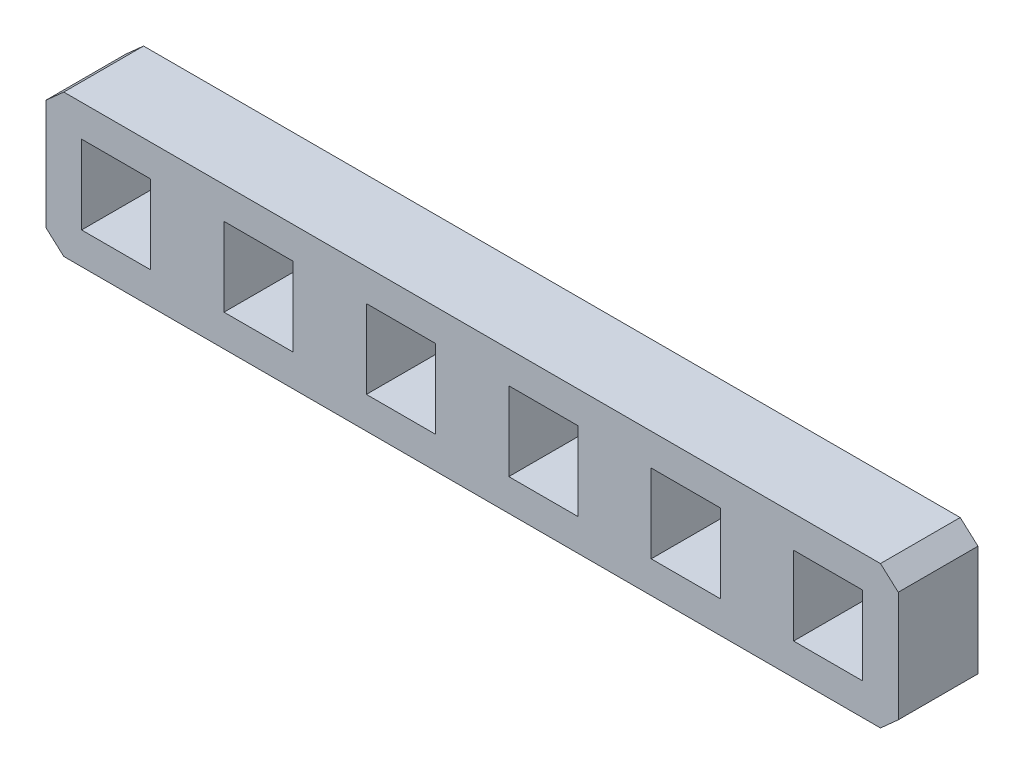
ISO-10303-21;
HEADER;
FILE_DESCRIPTION(('STEP AP214'),'2;1');
FILE_NAME('part.step','',(''),(''),'','','');
FILE_SCHEMA(('AUTOMOTIVE_DESIGN { 1 0 10303 214 1 1 1 1 }'));
ENDSEC;
DATA;
#1=APPLICATION_CONTEXT('core data for automotive mechanical design processes');
#2=APPLICATION_PROTOCOL_DEFINITION('international standard','automotive_design',2000,#1);
#3=PRODUCT_CONTEXT('',#1,'mechanical');
#4=PRODUCT('Part','Part','',(#3));
#5=PRODUCT_RELATED_PRODUCT_CATEGORY('part','',(#4));
#6=PRODUCT_DEFINITION_FORMATION('','',#4);
#7=PRODUCT_DEFINITION_CONTEXT('part definition',#1,'design');
#8=PRODUCT_DEFINITION('design','',#6,#7);
#9=PRODUCT_DEFINITION_SHAPE('','',#8);
#10=(LENGTH_UNIT() NAMED_UNIT(*) SI_UNIT(.MILLI.,.METRE.));
#11=(NAMED_UNIT(*) PLANE_ANGLE_UNIT() SI_UNIT($,.RADIAN.));
#12=(NAMED_UNIT(*) SI_UNIT($,.STERADIAN.) SOLID_ANGLE_UNIT());
#13=UNCERTAINTY_MEASURE_WITH_UNIT(LENGTH_MEASURE(1.E-05),#10,'distance_accuracy_value','');
#14=(GEOMETRIC_REPRESENTATION_CONTEXT(3) GLOBAL_UNCERTAINTY_ASSIGNED_CONTEXT((#13)) GLOBAL_UNIT_ASSIGNED_CONTEXT((#10,
#11,#12)) REPRESENTATION_CONTEXT('',''));
#15=CARTESIAN_POINT('',(0.,0.,0.));
#16=DIRECTION('',(0.,0.,1.));
#17=DIRECTION('',(1.,0.,0.));
#18=AXIS2_PLACEMENT_3D('',#15,#16,#17);
#19=CARTESIAN_POINT('',(0.,0.,5.6));
#20=DIRECTION('',(0.,0.,-1.));
#21=DIRECTION('',(-1.,0.,0.));
#22=AXIS2_PLACEMENT_3D('',#19,#20,#21);
#23=PLANE('',#22);
#24=DIRECTION('',(1.,0.,0.));
#25=VECTOR('',#24,1.);
#26=CARTESIAN_POINT('',(-18.05,-2.7625,5.6));
#27=LINE('',#26,#25);
#28=CARTESIAN_POINT('',(-18.05,-2.7625,5.6));
#29=VERTEX_POINT('',#28);
#30=CARTESIAN_POINT('',(-13.2,-2.7625,5.6));
#31=VERTEX_POINT('',#30);
#32=EDGE_CURVE('E278',#29,#31,#27,.T.);
#33=ORIENTED_EDGE('',*,*,#32,.F.);
#34=DIRECTION('',(0.,-1.,0.));
#35=VECTOR('',#34,1.);
#36=CARTESIAN_POINT('',(-18.05,-2.7625,5.6));
#37=LINE('',#36,#35);
#38=CARTESIAN_POINT('',(-18.05,2.7625,5.6));
#39=VERTEX_POINT('',#38);
#40=EDGE_CURVE('E286',#39,#29,#37,.T.);
#41=ORIENTED_EDGE('',*,*,#40,.F.);
#42=DIRECTION('',(-1.,0.,0.));
#43=VECTOR('',#42,1.);
#44=CARTESIAN_POINT('',(-18.05,2.7625,5.6));
#45=LINE('',#44,#43);
#46=CARTESIAN_POINT('',(-13.2,2.76250000000001,5.6));
#47=VERTEX_POINT('',#46);
#48=EDGE_CURVE('E283',#47,#39,#45,.T.);
#49=ORIENTED_EDGE('',*,*,#48,.F.);
#50=DIRECTION('',(0.,1.,0.));
#51=VECTOR('',#50,1.);
#52=CARTESIAN_POINT('',(-13.2,-2.7625,5.6));
#53=LINE('',#52,#51);
#54=EDGE_CURVE('E280',#31,#47,#53,.T.);
#55=ORIENTED_EDGE('',*,*,#54,.F.);
#56=EDGE_LOOP('',(#33,#41,#49,#55));
#57=FACE_BOUND('',#56,.T.);
#58=DIRECTION('',(0.,-1.,0.));
#59=VECTOR('',#58,1.);
#60=CARTESIAN_POINT('',(-28.05,-2.7625,5.6));
#61=LINE('',#60,#59);
#62=CARTESIAN_POINT('',(-28.05,2.7625,5.6));
#63=VERTEX_POINT('',#62);
#64=CARTESIAN_POINT('',(-28.05,-2.7625,5.6));
#65=VERTEX_POINT('',#64);
#66=EDGE_CURVE('E340',#63,#65,#61,.T.);
#67=ORIENTED_EDGE('',*,*,#66,.F.);
#68=DIRECTION('',(-1.,0.,0.));
#69=VECTOR('',#68,1.);
#70=CARTESIAN_POINT('',(-28.05,2.7625,5.6));
#71=LINE('',#70,#69);
#72=CARTESIAN_POINT('',(-23.1999999999999,2.76250000000001,5.6));
#73=VERTEX_POINT('',#72);
#74=EDGE_CURVE('E348',#73,#63,#71,.T.);
#75=ORIENTED_EDGE('',*,*,#74,.F.);
#76=DIRECTION('',(0.,1.,0.));
#77=VECTOR('',#76,1.);
#78=CARTESIAN_POINT('',(-23.1999999999999,-2.7625,5.6));
#79=LINE('',#78,#77);
#80=CARTESIAN_POINT('',(-23.1999999999999,-2.7625,5.6));
#81=VERTEX_POINT('',#80);
#82=EDGE_CURVE('E345',#81,#73,#79,.T.);
#83=ORIENTED_EDGE('',*,*,#82,.F.);
#84=DIRECTION('',(1.,0.,0.));
#85=VECTOR('',#84,1.);
#86=CARTESIAN_POINT('',(-28.05,-2.7625,5.6));
#87=LINE('',#86,#85);
#88=EDGE_CURVE('E342',#65,#81,#87,.T.);
#89=ORIENTED_EDGE('',*,*,#88,.F.);
#90=EDGE_LOOP('',(#67,#75,#83,#89));
#91=FACE_BOUND('',#90,.T.);
#92=DIRECTION('',(-1.,0.,0.));
#93=VECTOR('',#92,1.);
#94=CARTESIAN_POINT('',(21.95,2.7625,5.6));
#95=LINE('',#94,#93);
#96=CARTESIAN_POINT('',(26.8,2.76250000000001,5.6));
#97=VERTEX_POINT('',#96);
#98=CARTESIAN_POINT('',(21.95,2.7625,5.6));
#99=VERTEX_POINT('',#98);
#100=EDGE_CURVE('E402',#97,#99,#95,.T.);
#101=ORIENTED_EDGE('',*,*,#100,.F.);
#102=DIRECTION('',(0.,1.,0.));
#103=VECTOR('',#102,1.);
#104=CARTESIAN_POINT('',(26.8,-2.7625,5.6));
#105=LINE('',#104,#103);
#106=CARTESIAN_POINT('',(26.8,-2.7625,5.6));
#107=VERTEX_POINT('',#106);
#108=EDGE_CURVE('E410',#107,#97,#105,.T.);
#109=ORIENTED_EDGE('',*,*,#108,.F.);
#110=DIRECTION('',(1.,0.,0.));
#111=VECTOR('',#110,1.);
#112=CARTESIAN_POINT('',(21.95,-2.7625,5.6));
#113=LINE('',#112,#111);
#114=CARTESIAN_POINT('',(21.95,-2.7625,5.6));
#115=VERTEX_POINT('',#114);
#116=EDGE_CURVE('E407',#115,#107,#113,.T.);
#117=ORIENTED_EDGE('',*,*,#116,.F.);
#118=DIRECTION('',(0.,-1.,0.));
#119=VECTOR('',#118,1.);
#120=CARTESIAN_POINT('',(21.95,-2.7625,5.6));
#121=LINE('',#120,#119);
#122=EDGE_CURVE('E404',#99,#115,#121,.T.);
#123=ORIENTED_EDGE('',*,*,#122,.F.);
#124=EDGE_LOOP('',(#101,#109,#117,#123));
#125=FACE_BOUND('',#124,.T.);
#126=DIRECTION('',(-1.,0.,0.));
#127=VECTOR('',#126,1.);
#128=CARTESIAN_POINT('',(-29.3,4.99999999999998,5.6));
#129=LINE('',#128,#127);
#130=CARTESIAN_POINT('',(28.05,4.99999999999998,5.6));
#131=VERTEX_POINT('',#130);
#132=CARTESIAN_POINT('',(-29.3,4.99999999999998,5.6));
#133=VERTEX_POINT('',#132);
#134=EDGE_CURVE('E433',#131,#133,#129,.T.);
#135=ORIENTED_EDGE('',*,*,#134,.T.);
#136=DIRECTION('',(-0.745143863677784,-0.666903757991619,0.));
#137=VECTOR('',#136,1.);
#138=CARTESIAN_POINT('',(-29.3,4.99999999999998,5.6));
#139=LINE('',#138,#137);
#140=CARTESIAN_POINT('',(-30.55,3.88125,5.6));
#141=VERTEX_POINT('',#140);
#142=EDGE_CURVE('E436',#133,#141,#139,.T.);
#143=ORIENTED_EDGE('',*,*,#142,.T.);
#144=DIRECTION('',(0.,-1.,0.));
#145=VECTOR('',#144,1.);
#146=CARTESIAN_POINT('',(-30.55,3.88125,5.6));
#147=LINE('',#146,#145);
#148=CARTESIAN_POINT('',(-30.55,-3.88125000000001,5.6));
#149=VERTEX_POINT('',#148);
#150=EDGE_CURVE('E439',#141,#149,#147,.T.);
#151=ORIENTED_EDGE('',*,*,#150,.T.);
#152=DIRECTION('',(0.745143863677783,-0.66690375799162,0.));
#153=VECTOR('',#152,1.);
#154=CARTESIAN_POINT('',(-29.3,-4.99999999999999,5.6));
#155=LINE('',#154,#153);
#156=CARTESIAN_POINT('',(-29.3,-4.99999999999999,5.6));
#157=VERTEX_POINT('',#156);
#158=EDGE_CURVE('E441',#149,#157,#155,.T.);
#159=ORIENTED_EDGE('',*,*,#158,.T.);
#160=DIRECTION('',(1.,0.,0.));
#161=VECTOR('',#160,1.);
#162=CARTESIAN_POINT('',(-29.3,-4.99999999999999,5.6));
#163=LINE('',#162,#161);
#164=CARTESIAN_POINT('',(28.05,-5.00000000000002,5.6));
#165=VERTEX_POINT('',#164);
#166=EDGE_CURVE('E443',#157,#165,#163,.T.);
#167=ORIENTED_EDGE('',*,*,#166,.T.);
#168=DIRECTION('',(0.745143863677787,0.666903757991616,0.));
#169=VECTOR('',#168,1.);
#170=CARTESIAN_POINT('',(28.05,-5.00000000000002,5.6));
#171=LINE('',#170,#169);
#172=CARTESIAN_POINT('',(29.3,-3.88125000000003,5.6));
#173=VERTEX_POINT('',#172);
#174=EDGE_CURVE('E445',#165,#173,#171,.T.);
#175=ORIENTED_EDGE('',*,*,#174,.T.);
#176=DIRECTION('',(0.,1.,0.));
#177=VECTOR('',#176,1.);
#178=CARTESIAN_POINT('',(29.3,3.88125,5.6));
#179=LINE('',#178,#177);
#180=CARTESIAN_POINT('',(29.3,3.88125,5.6));
#181=VERTEX_POINT('',#180);
#182=EDGE_CURVE('E447',#173,#181,#179,.T.);
#183=ORIENTED_EDGE('',*,*,#182,.T.);
#184=DIRECTION('',(-0.745143863677786,0.666903757991617,0.));
#185=VECTOR('',#184,1.);
#186=CARTESIAN_POINT('',(28.05,4.99999999999998,5.6));
#187=LINE('',#186,#185);
#188=EDGE_CURVE('E449',#181,#131,#187,.T.);
#189=ORIENTED_EDGE('',*,*,#188,.T.);
#190=EDGE_LOOP('',(#135,#143,#151,#159,#167,#175,#183,#189));
#191=FACE_BOUND('',#190,.T.);
#192=DIRECTION('',(-1.,0.,0.));
#193=VECTOR('',#192,1.);
#194=CARTESIAN_POINT('',(11.95,2.7625,5.6));
#195=LINE('',#194,#193);
#196=CARTESIAN_POINT('',(16.8,2.76250000000001,5.6));
#197=VERTEX_POINT('',#196);
#198=CARTESIAN_POINT('',(11.95,2.7625,5.6));
#199=VERTEX_POINT('',#198);
#200=EDGE_CURVE('E371',#197,#199,#195,.T.);
#201=ORIENTED_EDGE('',*,*,#200,.F.);
#202=DIRECTION('',(0.,1.,0.));
#203=VECTOR('',#202,1.);
#204=CARTESIAN_POINT('',(16.8,-2.7625,5.6));
#205=LINE('',#204,#203);
#206=CARTESIAN_POINT('',(16.8,-2.7625,5.6));
#207=VERTEX_POINT('',#206);
#208=EDGE_CURVE('E379',#207,#197,#205,.T.);
#209=ORIENTED_EDGE('',*,*,#208,.F.);
#210=DIRECTION('',(1.,0.,0.));
#211=VECTOR('',#210,1.);
#212=CARTESIAN_POINT('',(11.95,-2.7625,5.6));
#213=LINE('',#212,#211);
#214=CARTESIAN_POINT('',(11.95,-2.7625,5.6));
#215=VERTEX_POINT('',#214);
#216=EDGE_CURVE('E376',#215,#207,#213,.T.);
#217=ORIENTED_EDGE('',*,*,#216,.F.);
#218=DIRECTION('',(0.,-1.,0.));
#219=VECTOR('',#218,1.);
#220=CARTESIAN_POINT('',(11.95,-2.7625,5.6));
#221=LINE('',#220,#219);
#222=EDGE_CURVE('E373',#199,#215,#221,.T.);
#223=ORIENTED_EDGE('',*,*,#222,.F.);
#224=EDGE_LOOP('',(#201,#209,#217,#223));
#225=FACE_BOUND('',#224,.T.);
#226=DIRECTION('',(-1.,0.,0.));
#227=VECTOR('',#226,1.);
#228=CARTESIAN_POINT('',(1.95000000000003,2.7625,5.6));
#229=LINE('',#228,#227);
#230=CARTESIAN_POINT('',(6.80000000000005,2.76250000000001,5.6));
#231=VERTEX_POINT('',#230);
#232=CARTESIAN_POINT('',(1.95000000000003,2.7625,5.6));
#233=VERTEX_POINT('',#232);
#234=EDGE_CURVE('E309',#231,#233,#229,.T.);
#235=ORIENTED_EDGE('',*,*,#234,.F.);
#236=DIRECTION('',(0.,1.,0.));
#237=VECTOR('',#236,1.);
#238=CARTESIAN_POINT('',(6.80000000000005,-2.7625,5.6));
#239=LINE('',#238,#237);
#240=CARTESIAN_POINT('',(6.80000000000005,-2.7625,5.6));
#241=VERTEX_POINT('',#240);
#242=EDGE_CURVE('E317',#241,#231,#239,.T.);
#243=ORIENTED_EDGE('',*,*,#242,.F.);
#244=DIRECTION('',(1.,0.,0.));
#245=VECTOR('',#244,1.);
#246=CARTESIAN_POINT('',(1.95000000000003,-2.7625,5.6));
#247=LINE('',#246,#245);
#248=CARTESIAN_POINT('',(1.95000000000003,-2.7625,5.6));
#249=VERTEX_POINT('',#248);
#250=EDGE_CURVE('E314',#249,#241,#247,.T.);
#251=ORIENTED_EDGE('',*,*,#250,.F.);
#252=DIRECTION('',(0.,-1.,0.));
#253=VECTOR('',#252,1.);
#254=CARTESIAN_POINT('',(1.95000000000003,-2.7625,5.6));
#255=LINE('',#254,#253);
#256=EDGE_CURVE('E311',#233,#249,#255,.T.);
#257=ORIENTED_EDGE('',*,*,#256,.F.);
#258=EDGE_LOOP('',(#235,#243,#251,#257));
#259=FACE_BOUND('',#258,.T.);
#260=DIRECTION('',(1.,0.,0.));
#261=VECTOR('',#260,1.);
#262=CARTESIAN_POINT('',(-8.04999999999997,-2.7625,5.6));
#263=LINE('',#262,#261);
#264=CARTESIAN_POINT('',(-8.04999999999997,-2.7625,5.6));
#265=VERTEX_POINT('',#264);
#266=CARTESIAN_POINT('',(-3.19999999999995,-2.7625,5.6));
#267=VERTEX_POINT('',#266);
#268=EDGE_CURVE('E242',#265,#267,#263,.T.);
#269=ORIENTED_EDGE('',*,*,#268,.F.);
#270=DIRECTION('',(0.,-1.,0.));
#271=VECTOR('',#270,1.);
#272=CARTESIAN_POINT('',(-8.04999999999997,-2.7625,5.6));
#273=LINE('',#272,#271);
#274=CARTESIAN_POINT('',(-8.04999999999997,2.7625,5.6));
#275=VERTEX_POINT('',#274);
#276=EDGE_CURVE('E264',#275,#265,#273,.T.);
#277=ORIENTED_EDGE('',*,*,#276,.F.);
#278=DIRECTION('',(-1.,0.,0.));
#279=VECTOR('',#278,1.);
#280=CARTESIAN_POINT('',(-8.04999999999997,2.7625,5.6));
#281=LINE('',#280,#279);
#282=CARTESIAN_POINT('',(-3.19999999999995,2.76250000000001,5.6));
#283=VERTEX_POINT('',#282);
#284=EDGE_CURVE('E262',#283,#275,#281,.T.);
#285=ORIENTED_EDGE('',*,*,#284,.F.);
#286=DIRECTION('',(0.,1.,0.));
#287=VECTOR('',#286,1.);
#288=CARTESIAN_POINT('',(-3.19999999999995,-2.7625,5.6));
#289=LINE('',#288,#287);
#290=EDGE_CURVE('E250',#267,#283,#289,.T.);
#291=ORIENTED_EDGE('',*,*,#290,.F.);
#292=EDGE_LOOP('',(#269,#277,#285,#291));
#293=FACE_BOUND('',#292,.T.);
#294=ADVANCED_FACE('F33',(#57,#91,#125,#191,#225,#259,#293),#23,.F.);
#295=CARTESIAN_POINT('',(0.,0.,0.));
#296=DIRECTION('',(0.,0.,-1.));
#297=DIRECTION('',(-1.,0.,0.));
#298=AXIS2_PLACEMENT_3D('',#295,#296,#297);
#299=PLANE('',#298);
#300=DIRECTION('',(-1.,0.,0.));
#301=VECTOR('',#300,1.);
#302=CARTESIAN_POINT('',(-29.3,4.99999999999998,0.));
#303=LINE('',#302,#301);
#304=CARTESIAN_POINT('',(28.05,4.99999999999998,0.));
#305=VERTEX_POINT('',#304);
#306=CARTESIAN_POINT('',(-29.3,4.99999999999998,0.));
#307=VERTEX_POINT('',#306);
#308=EDGE_CURVE('E432',#305,#307,#303,.T.);
#309=ORIENTED_EDGE('',*,*,#308,.F.);
#310=DIRECTION('',(-0.745143863677786,0.666903757991617,0.));
#311=VECTOR('',#310,1.);
#312=CARTESIAN_POINT('',(28.05,4.99999999999998,0.));
#313=LINE('',#312,#311);
#314=CARTESIAN_POINT('',(29.3,3.88125,0.));
#315=VERTEX_POINT('',#314);
#316=EDGE_CURVE('E437',#315,#305,#313,.T.);
#317=ORIENTED_EDGE('',*,*,#316,.F.);
#318=DIRECTION('',(0.,1.,0.));
#319=VECTOR('',#318,1.);
#320=CARTESIAN_POINT('',(29.3,3.88125,0.));
#321=LINE('',#320,#319);
#322=CARTESIAN_POINT('',(29.3,-3.88125000000003,0.));
#323=VERTEX_POINT('',#322);
#324=EDGE_CURVE('E464',#323,#315,#321,.T.);
#325=ORIENTED_EDGE('',*,*,#324,.F.);
#326=DIRECTION('',(0.745143863677787,0.666903757991616,0.));
#327=VECTOR('',#326,1.);
#328=CARTESIAN_POINT('',(28.05,-5.00000000000002,0.));
#329=LINE('',#328,#327);
#330=CARTESIAN_POINT('',(28.05,-5.00000000000002,0.));
#331=VERTEX_POINT('',#330);
#332=EDGE_CURVE('E462',#331,#323,#329,.T.);
#333=ORIENTED_EDGE('',*,*,#332,.F.);
#334=DIRECTION('',(1.,0.,0.));
#335=VECTOR('',#334,1.);
#336=CARTESIAN_POINT('',(-29.3,-4.99999999999999,0.));
#337=LINE('',#336,#335);
#338=CARTESIAN_POINT('',(-29.3,-4.99999999999999,0.));
#339=VERTEX_POINT('',#338);
#340=EDGE_CURVE('E460',#339,#331,#337,.T.);
#341=ORIENTED_EDGE('',*,*,#340,.F.);
#342=DIRECTION('',(0.745143863677783,-0.66690375799162,0.));
#343=VECTOR('',#342,1.);
#344=CARTESIAN_POINT('',(-29.3,-4.99999999999999,0.));
#345=LINE('',#344,#343);
#346=CARTESIAN_POINT('',(-30.55,-3.88125000000001,0.));
#347=VERTEX_POINT('',#346);
#348=EDGE_CURVE('E458',#347,#339,#345,.T.);
#349=ORIENTED_EDGE('',*,*,#348,.F.);
#350=DIRECTION('',(0.,-1.,0.));
#351=VECTOR('',#350,1.);
#352=CARTESIAN_POINT('',(-30.55,3.88125,0.));
#353=LINE('',#352,#351);
#354=CARTESIAN_POINT('',(-30.55,3.88125,0.));
#355=VERTEX_POINT('',#354);
#356=EDGE_CURVE('E456',#355,#347,#353,.T.);
#357=ORIENTED_EDGE('',*,*,#356,.F.);
#358=DIRECTION('',(-0.745143863677784,-0.666903757991619,0.));
#359=VECTOR('',#358,1.);
#360=CARTESIAN_POINT('',(-29.3,4.99999999999998,0.));
#361=LINE('',#360,#359);
#362=EDGE_CURVE('E454',#307,#355,#361,.T.);
#363=ORIENTED_EDGE('',*,*,#362,.F.);
#364=EDGE_LOOP('',(#309,#317,#325,#333,#341,#349,#357,#363));
#365=FACE_BOUND('',#364,.T.);
#366=DIRECTION('',(0.,1.,0.));
#367=VECTOR('',#366,1.);
#368=CARTESIAN_POINT('',(26.8,-2.7625,0.));
#369=LINE('',#368,#367);
#370=CARTESIAN_POINT('',(26.8,-2.7625,0.));
#371=VERTEX_POINT('',#370);
#372=CARTESIAN_POINT('',(26.8,2.76250000000001,0.));
#373=VERTEX_POINT('',#372);
#374=EDGE_CURVE('E405',#371,#373,#369,.T.);
#375=ORIENTED_EDGE('',*,*,#374,.T.);
#376=DIRECTION('',(-1.,0.,0.));
#377=VECTOR('',#376,1.);
#378=CARTESIAN_POINT('',(21.95,2.7625,0.));
#379=LINE('',#378,#377);
#380=CARTESIAN_POINT('',(21.95,2.7625,0.));
#381=VERTEX_POINT('',#380);
#382=EDGE_CURVE('E401',#373,#381,#379,.T.);
#383=ORIENTED_EDGE('',*,*,#382,.T.);
#384=DIRECTION('',(0.,-1.,0.));
#385=VECTOR('',#384,1.);
#386=CARTESIAN_POINT('',(21.95,-2.7625,0.));
#387=LINE('',#386,#385);
#388=CARTESIAN_POINT('',(21.95,-2.7625,0.));
#389=VERTEX_POINT('',#388);
#390=EDGE_CURVE('E415',#381,#389,#387,.T.);
#391=ORIENTED_EDGE('',*,*,#390,.T.);
#392=DIRECTION('',(1.,0.,0.));
#393=VECTOR('',#392,1.);
#394=CARTESIAN_POINT('',(21.95,-2.7625,0.));
#395=LINE('',#394,#393);
#396=EDGE_CURVE('E418',#389,#371,#395,.T.);
#397=ORIENTED_EDGE('',*,*,#396,.T.);
#398=EDGE_LOOP('',(#375,#383,#391,#397));
#399=FACE_BOUND('',#398,.T.);
#400=DIRECTION('',(0.,1.,0.));
#401=VECTOR('',#400,1.);
#402=CARTESIAN_POINT('',(16.8,-2.7625,0.));
#403=LINE('',#402,#401);
#404=CARTESIAN_POINT('',(16.8,-2.7625,0.));
#405=VERTEX_POINT('',#404);
#406=CARTESIAN_POINT('',(16.8,2.76250000000001,0.));
#407=VERTEX_POINT('',#406);
#408=EDGE_CURVE('E374',#405,#407,#403,.T.);
#409=ORIENTED_EDGE('',*,*,#408,.T.);
#410=DIRECTION('',(-1.,0.,0.));
#411=VECTOR('',#410,1.);
#412=CARTESIAN_POINT('',(11.95,2.7625,0.));
#413=LINE('',#412,#411);
#414=CARTESIAN_POINT('',(11.95,2.7625,0.));
#415=VERTEX_POINT('',#414);
#416=EDGE_CURVE('E370',#407,#415,#413,.T.);
#417=ORIENTED_EDGE('',*,*,#416,.T.);
#418=DIRECTION('',(0.,-1.,0.));
#419=VECTOR('',#418,1.);
#420=CARTESIAN_POINT('',(11.95,-2.7625,0.));
#421=LINE('',#420,#419);
#422=CARTESIAN_POINT('',(11.95,-2.7625,0.));
#423=VERTEX_POINT('',#422);
#424=EDGE_CURVE('E384',#415,#423,#421,.T.);
#425=ORIENTED_EDGE('',*,*,#424,.T.);
#426=DIRECTION('',(1.,0.,0.));
#427=VECTOR('',#426,1.);
#428=CARTESIAN_POINT('',(11.95,-2.7625,0.));
#429=LINE('',#428,#427);
#430=EDGE_CURVE('E387',#423,#405,#429,.T.);
#431=ORIENTED_EDGE('',*,*,#430,.T.);
#432=EDGE_LOOP('',(#409,#417,#425,#431));
#433=FACE_BOUND('',#432,.T.);
#434=DIRECTION('',(-1.,0.,0.));
#435=VECTOR('',#434,1.);
#436=CARTESIAN_POINT('',(-28.05,2.7625,0.));
#437=LINE('',#436,#435);
#438=CARTESIAN_POINT('',(-23.1999999999999,2.76250000000001,0.));
#439=VERTEX_POINT('',#438);
#440=CARTESIAN_POINT('',(-28.05,2.7625,0.));
#441=VERTEX_POINT('',#440);
#442=EDGE_CURVE('E343',#439,#441,#437,.T.);
#443=ORIENTED_EDGE('',*,*,#442,.T.);
#444=DIRECTION('',(0.,-1.,0.));
#445=VECTOR('',#444,1.);
#446=CARTESIAN_POINT('',(-28.05,-2.7625,0.));
#447=LINE('',#446,#445);
#448=CARTESIAN_POINT('',(-28.05,-2.7625,0.));
#449=VERTEX_POINT('',#448);
#450=EDGE_CURVE('E339',#441,#449,#447,.T.);
#451=ORIENTED_EDGE('',*,*,#450,.T.);
#452=DIRECTION('',(1.,0.,0.));
#453=VECTOR('',#452,1.);
#454=CARTESIAN_POINT('',(-28.05,-2.7625,0.));
#455=LINE('',#454,#453);
#456=CARTESIAN_POINT('',(-23.1999999999999,-2.7625,0.));
#457=VERTEX_POINT('',#456);
#458=EDGE_CURVE('E353',#449,#457,#455,.T.);
#459=ORIENTED_EDGE('',*,*,#458,.T.);
#460=DIRECTION('',(0.,1.,0.));
#461=VECTOR('',#460,1.);
#462=CARTESIAN_POINT('',(-23.1999999999999,-2.7625,0.));
#463=LINE('',#462,#461);
#464=EDGE_CURVE('E356',#457,#439,#463,.T.);
#465=ORIENTED_EDGE('',*,*,#464,.T.);
#466=EDGE_LOOP('',(#443,#451,#459,#465));
#467=FACE_BOUND('',#466,.T.);
#468=DIRECTION('',(0.,1.,0.));
#469=VECTOR('',#468,1.);
#470=CARTESIAN_POINT('',(6.80000000000005,-2.7625,0.));
#471=LINE('',#470,#469);
#472=CARTESIAN_POINT('',(6.80000000000005,-2.7625,0.));
#473=VERTEX_POINT('',#472);
#474=CARTESIAN_POINT('',(6.80000000000005,2.76250000000001,0.));
#475=VERTEX_POINT('',#474);
#476=EDGE_CURVE('E312',#473,#475,#471,.T.);
#477=ORIENTED_EDGE('',*,*,#476,.T.);
#478=DIRECTION('',(-1.,0.,0.));
#479=VECTOR('',#478,1.);
#480=CARTESIAN_POINT('',(1.95000000000003,2.7625,0.));
#481=LINE('',#480,#479);
#482=CARTESIAN_POINT('',(1.95000000000003,2.7625,0.));
#483=VERTEX_POINT('',#482);
#484=EDGE_CURVE('E308',#475,#483,#481,.T.);
#485=ORIENTED_EDGE('',*,*,#484,.T.);
#486=DIRECTION('',(0.,-1.,0.));
#487=VECTOR('',#486,1.);
#488=CARTESIAN_POINT('',(1.95000000000003,-2.7625,0.));
#489=LINE('',#488,#487);
#490=CARTESIAN_POINT('',(1.95000000000003,-2.7625,0.));
#491=VERTEX_POINT('',#490);
#492=EDGE_CURVE('E322',#483,#491,#489,.T.);
#493=ORIENTED_EDGE('',*,*,#492,.T.);
#494=DIRECTION('',(1.,0.,0.));
#495=VECTOR('',#494,1.);
#496=CARTESIAN_POINT('',(1.95000000000003,-2.7625,0.));
#497=LINE('',#496,#495);
#498=EDGE_CURVE('E325',#491,#473,#497,.T.);
#499=ORIENTED_EDGE('',*,*,#498,.T.);
#500=EDGE_LOOP('',(#477,#485,#493,#499));
#501=FACE_BOUND('',#500,.T.);
#502=DIRECTION('',(0.,-1.,0.));
#503=VECTOR('',#502,1.);
#504=CARTESIAN_POINT('',(-18.05,-2.7625,0.));
#505=LINE('',#504,#503);
#506=CARTESIAN_POINT('',(-18.05,2.7625,0.));
#507=VERTEX_POINT('',#506);
#508=CARTESIAN_POINT('',(-18.05,-2.7625,0.));
#509=VERTEX_POINT('',#508);
#510=EDGE_CURVE('E281',#507,#509,#505,.T.);
#511=ORIENTED_EDGE('',*,*,#510,.T.);
#512=DIRECTION('',(1.,0.,0.));
#513=VECTOR('',#512,1.);
#514=CARTESIAN_POINT('',(-18.05,-2.7625,0.));
#515=LINE('',#514,#513);
#516=CARTESIAN_POINT('',(-13.2,-2.7625,0.));
#517=VERTEX_POINT('',#516);
#518=EDGE_CURVE('E258',#509,#517,#515,.T.);
#519=ORIENTED_EDGE('',*,*,#518,.T.);
#520=DIRECTION('',(0.,1.,0.));
#521=VECTOR('',#520,1.);
#522=CARTESIAN_POINT('',(-13.2,-2.7625,0.));
#523=LINE('',#522,#521);
#524=CARTESIAN_POINT('',(-13.2,2.76250000000001,0.));
#525=VERTEX_POINT('',#524);
#526=EDGE_CURVE('E291',#517,#525,#523,.T.);
#527=ORIENTED_EDGE('',*,*,#526,.T.);
#528=DIRECTION('',(-1.,0.,0.));
#529=VECTOR('',#528,1.);
#530=CARTESIAN_POINT('',(-18.05,2.7625,0.));
#531=LINE('',#530,#529);
#532=EDGE_CURVE('E294',#525,#507,#531,.T.);
#533=ORIENTED_EDGE('',*,*,#532,.T.);
#534=EDGE_LOOP('',(#511,#519,#527,#533));
#535=FACE_BOUND('',#534,.T.);
#536=DIRECTION('',(0.,-1.,0.));
#537=VECTOR('',#536,1.);
#538=CARTESIAN_POINT('',(-8.04999999999997,-2.7625,0.));
#539=LINE('',#538,#537);
#540=CARTESIAN_POINT('',(-8.04999999999997,2.7625,0.));
#541=VERTEX_POINT('',#540);
#542=CARTESIAN_POINT('',(-8.04999999999997,-2.7625,0.));
#543=VERTEX_POINT('',#542);
#544=EDGE_CURVE('E251',#541,#543,#539,.T.);
#545=ORIENTED_EDGE('',*,*,#544,.T.);
#546=DIRECTION('',(1.,0.,0.));
#547=VECTOR('',#546,1.);
#548=CARTESIAN_POINT('',(-8.04999999999997,-2.7625,0.));
#549=LINE('',#548,#547);
#550=CARTESIAN_POINT('',(-3.19999999999995,-2.7625,0.));
#551=VERTEX_POINT('',#550);
#552=EDGE_CURVE('E56',#543,#551,#549,.T.);
#553=ORIENTED_EDGE('',*,*,#552,.T.);
#554=DIRECTION('',(0.,1.,0.));
#555=VECTOR('',#554,1.);
#556=CARTESIAN_POINT('',(-3.19999999999995,-2.7625,0.));
#557=LINE('',#556,#555);
#558=CARTESIAN_POINT('',(-3.19999999999995,2.76250000000001,0.));
#559=VERTEX_POINT('',#558);
#560=EDGE_CURVE('E257',#551,#559,#557,.T.);
#561=ORIENTED_EDGE('',*,*,#560,.T.);
#562=DIRECTION('',(-1.,0.,0.));
#563=VECTOR('',#562,1.);
#564=CARTESIAN_POINT('',(-8.04999999999997,2.7625,0.));
#565=LINE('',#564,#563);
#566=EDGE_CURVE('E270',#559,#541,#565,.T.);
#567=ORIENTED_EDGE('',*,*,#566,.T.);
#568=EDGE_LOOP('',(#545,#553,#561,#567));
#569=FACE_BOUND('',#568,.T.);
#570=ADVANCED_FACE('F494',(#365,#399,#433,#467,#501,#535,#569),#299,.T.);
#571=CARTESIAN_POINT('',(-29.3,4.99999999999998,5.6));
#572=DIRECTION('',(0.,-1.,0.));
#573=DIRECTION('',(0.,0.,-1.));
#574=AXIS2_PLACEMENT_3D('',#571,#572,#573);
#575=PLANE('',#574);
#576=ORIENTED_EDGE('',*,*,#308,.T.);
#577=DIRECTION('',(0.,0.,-1.));
#578=VECTOR('',#577,1.);
#579=CARTESIAN_POINT('',(-29.3,4.99999999999998,5.6));
#580=LINE('',#579,#578);
#581=EDGE_CURVE('E11',#133,#307,#580,.T.);
#582=ORIENTED_EDGE('',*,*,#581,.F.);
#583=ORIENTED_EDGE('',*,*,#134,.F.);
#584=DIRECTION('',(0.,0.,-1.));
#585=VECTOR('',#584,1.);
#586=CARTESIAN_POINT('',(28.05,4.99999999999998,5.6));
#587=LINE('',#586,#585);
#588=EDGE_CURVE('E451',#131,#305,#587,.T.);
#589=ORIENTED_EDGE('',*,*,#588,.T.);
#590=EDGE_LOOP('',(#576,#582,#583,#589));
#591=FACE_BOUND('',#590,.T.);
#592=ADVANCED_FACE('F35',(#591),#575,.F.);
#593=CARTESIAN_POINT('',(-29.3,4.99999999999998,5.6));
#594=DIRECTION('',(0.666903757991619,-0.745143863677784,0.));
#595=DIRECTION('',(0.745143863677784,0.666903757991619,0.));
#596=AXIS2_PLACEMENT_3D('',#593,#594,#595);
#597=PLANE('',#596);
#598=ORIENTED_EDGE('',*,*,#362,.T.);
#599=DIRECTION('',(0.,0.,-1.));
#600=VECTOR('',#599,1.);
#601=CARTESIAN_POINT('',(-30.55,3.88125,5.6));
#602=LINE('',#601,#600);
#603=EDGE_CURVE('E41',#141,#355,#602,.T.);
#604=ORIENTED_EDGE('',*,*,#603,.F.);
#605=ORIENTED_EDGE('',*,*,#142,.F.);
#606=ORIENTED_EDGE('',*,*,#581,.T.);
#607=EDGE_LOOP('',(#598,#604,#605,#606));
#608=FACE_BOUND('',#607,.T.);
#609=ADVANCED_FACE('F512',(#608),#597,.F.);
#610=CARTESIAN_POINT('',(-30.55,3.88125,5.6));
#611=DIRECTION('',(1.,0.,0.));
#612=DIRECTION('',(0.,0.,-1.));
#613=AXIS2_PLACEMENT_3D('',#610,#611,#612);
#614=PLANE('',#613);
#615=ORIENTED_EDGE('',*,*,#356,.T.);
#616=DIRECTION('',(0.,0.,-1.));
#617=VECTOR('',#616,1.);
#618=CARTESIAN_POINT('',(-30.55,-3.88125000000001,5.6));
#619=LINE('',#618,#617);
#620=EDGE_CURVE('E481',#149,#347,#619,.T.);
#621=ORIENTED_EDGE('',*,*,#620,.F.);
#622=ORIENTED_EDGE('',*,*,#150,.F.);
#623=ORIENTED_EDGE('',*,*,#603,.T.);
#624=EDGE_LOOP('',(#615,#621,#622,#623));
#625=FACE_BOUND('',#624,.T.);
#626=ADVANCED_FACE('F488',(#625),#614,.F.);
#627=CARTESIAN_POINT('',(-29.3,-4.99999999999999,5.6));
#628=DIRECTION('',(0.66690375799162,0.745143863677783,0.));
#629=DIRECTION('',(-0.745143863677783,0.66690375799162,0.));
#630=AXIS2_PLACEMENT_3D('',#627,#628,#629);
#631=PLANE('',#630);
#632=ORIENTED_EDGE('',*,*,#348,.T.);
#633=DIRECTION('',(0.,0.,-1.));
#634=VECTOR('',#633,1.);
#635=CARTESIAN_POINT('',(-29.3,-4.99999999999999,5.6));
#636=LINE('',#635,#634);
#637=EDGE_CURVE('E478',#157,#339,#636,.T.);
#638=ORIENTED_EDGE('',*,*,#637,.F.);
#639=ORIENTED_EDGE('',*,*,#158,.F.);
#640=ORIENTED_EDGE('',*,*,#620,.T.);
#641=EDGE_LOOP('',(#632,#638,#639,#640));
#642=FACE_BOUND('',#641,.T.);
#643=ADVANCED_FACE('F500',(#642),#631,.F.);
#644=CARTESIAN_POINT('',(-29.3,-4.99999999999999,5.6));
#645=DIRECTION('',(0.,1.,0.));
#646=DIRECTION('',(-1.,0.,0.));
#647=AXIS2_PLACEMENT_3D('',#644,#645,#646);
#648=PLANE('',#647);
#649=ORIENTED_EDGE('',*,*,#340,.T.);
#650=DIRECTION('',(0.,0.,-1.));
#651=VECTOR('',#650,1.);
#652=CARTESIAN_POINT('',(28.05,-5.00000000000002,5.6));
#653=LINE('',#652,#651);
#654=EDGE_CURVE('E475',#165,#331,#653,.T.);
#655=ORIENTED_EDGE('',*,*,#654,.F.);
#656=ORIENTED_EDGE('',*,*,#166,.F.);
#657=ORIENTED_EDGE('',*,*,#637,.T.);
#658=EDGE_LOOP('',(#649,#655,#656,#657));
#659=FACE_BOUND('',#658,.T.);
#660=ADVANCED_FACE('F504',(#659),#648,.F.);
#661=CARTESIAN_POINT('',(28.05,-5.00000000000002,5.6));
#662=DIRECTION('',(-0.666903757991616,0.745143863677787,0.));
#663=DIRECTION('',(-0.745143863677787,-0.666903757991616,0.));
#664=AXIS2_PLACEMENT_3D('',#661,#662,#663);
#665=PLANE('',#664);
#666=ORIENTED_EDGE('',*,*,#332,.T.);
#667=DIRECTION('',(0.,0.,-1.));
#668=VECTOR('',#667,1.);
#669=CARTESIAN_POINT('',(29.3,-3.88125000000003,5.6));
#670=LINE('',#669,#668);
#671=EDGE_CURVE('E472',#173,#323,#670,.T.);
#672=ORIENTED_EDGE('',*,*,#671,.F.);
#673=ORIENTED_EDGE('',*,*,#174,.F.);
#674=ORIENTED_EDGE('',*,*,#654,.T.);
#675=EDGE_LOOP('',(#666,#672,#673,#674));
#676=FACE_BOUND('',#675,.T.);
#677=ADVANCED_FACE('F525',(#676),#665,.F.);
#678=CARTESIAN_POINT('',(29.3,3.88125,5.6));
#679=DIRECTION('',(-1.,0.,0.));
#680=DIRECTION('',(0.,0.,1.));
#681=AXIS2_PLACEMENT_3D('',#678,#679,#680);
#682=PLANE('',#681);
#683=ORIENTED_EDGE('',*,*,#324,.T.);
#684=DIRECTION('',(0.,0.,-1.));
#685=VECTOR('',#684,1.);
#686=CARTESIAN_POINT('',(29.3,3.88125,5.6));
#687=LINE('',#686,#685);
#688=EDGE_CURVE('E469',#181,#315,#687,.T.);
#689=ORIENTED_EDGE('',*,*,#688,.F.);
#690=ORIENTED_EDGE('',*,*,#182,.F.);
#691=ORIENTED_EDGE('',*,*,#671,.T.);
#692=EDGE_LOOP('',(#683,#689,#690,#691));
#693=FACE_BOUND('',#692,.T.);
#694=ADVANCED_FACE('F523',(#693),#682,.F.);
#695=CARTESIAN_POINT('',(28.05,4.99999999999998,5.6));
#696=DIRECTION('',(-0.666903757991617,-0.745143863677786,0.));
#697=DIRECTION('',(0.745143863677786,-0.666903757991617,0.));
#698=AXIS2_PLACEMENT_3D('',#695,#696,#697);
#699=PLANE('',#698);
#700=ORIENTED_EDGE('',*,*,#316,.T.);
#701=ORIENTED_EDGE('',*,*,#588,.F.);
#702=ORIENTED_EDGE('',*,*,#188,.F.);
#703=ORIENTED_EDGE('',*,*,#688,.T.);
#704=EDGE_LOOP('',(#700,#701,#702,#703));
#705=FACE_BOUND('',#704,.T.);
#706=ADVANCED_FACE('F518',(#705),#699,.F.);
#707=CARTESIAN_POINT('',(21.95,2.7625,5.6));
#708=DIRECTION('',(0.,-1.,0.));
#709=DIRECTION('',(1.,0.,0.));
#710=AXIS2_PLACEMENT_3D('',#707,#708,#709);
#711=PLANE('',#710);
#712=ORIENTED_EDGE('',*,*,#382,.F.);
#713=DIRECTION('',(0.,0.,-1.));
#714=VECTOR('',#713,1.);
#715=CARTESIAN_POINT('',(26.8,2.76250000000001,5.6));
#716=LINE('',#715,#714);
#717=EDGE_CURVE('E412',#97,#373,#716,.T.);
#718=ORIENTED_EDGE('',*,*,#717,.F.);
#719=ORIENTED_EDGE('',*,*,#100,.T.);
#720=DIRECTION('',(0.,0.,-1.));
#721=VECTOR('',#720,1.);
#722=CARTESIAN_POINT('',(21.95,2.7625,5.6));
#723=LINE('',#722,#721);
#724=EDGE_CURVE('E429',#99,#381,#723,.T.);
#725=ORIENTED_EDGE('',*,*,#724,.T.);
#726=EDGE_LOOP('',(#712,#718,#719,#725));
#727=FACE_BOUND('',#726,.T.);
#728=ADVANCED_FACE('F544',(#727),#711,.T.);
#729=CARTESIAN_POINT('',(21.95,-2.7625,5.6));
#730=DIRECTION('',(1.,0.,0.));
#731=DIRECTION('',(0.,0.,-1.));
#732=AXIS2_PLACEMENT_3D('',#729,#730,#731);
#733=PLANE('',#732);
#734=ORIENTED_EDGE('',*,*,#390,.F.);
#735=ORIENTED_EDGE('',*,*,#724,.F.);
#736=ORIENTED_EDGE('',*,*,#122,.T.);
#737=DIRECTION('',(0.,0.,-1.));
#738=VECTOR('',#737,1.);
#739=CARTESIAN_POINT('',(21.95,-2.7625,5.6));
#740=LINE('',#739,#738);
#741=EDGE_CURVE('E427',#115,#389,#740,.T.);
#742=ORIENTED_EDGE('',*,*,#741,.T.);
#743=EDGE_LOOP('',(#734,#735,#736,#742));
#744=FACE_BOUND('',#743,.T.);
#745=ADVANCED_FACE('F551',(#744),#733,.T.);
#746=CARTESIAN_POINT('',(21.95,-2.7625,5.6));
#747=DIRECTION('',(0.,1.,0.));
#748=DIRECTION('',(0.,0.,1.));
#749=AXIS2_PLACEMENT_3D('',#746,#747,#748);
#750=PLANE('',#749);
#751=ORIENTED_EDGE('',*,*,#396,.F.);
#752=ORIENTED_EDGE('',*,*,#741,.F.);
#753=ORIENTED_EDGE('',*,*,#116,.T.);
#754=DIRECTION('',(0.,0.,-1.));
#755=VECTOR('',#754,1.);
#756=CARTESIAN_POINT('',(26.8,-2.7625,5.6));
#757=LINE('',#756,#755);
#758=EDGE_CURVE('E425',#107,#371,#757,.T.);
#759=ORIENTED_EDGE('',*,*,#758,.T.);
#760=EDGE_LOOP('',(#751,#752,#753,#759));
#761=FACE_BOUND('',#760,.T.);
#762=ADVANCED_FACE('F556',(#761),#750,.T.);
#763=CARTESIAN_POINT('',(26.8,-2.7625,5.6));
#764=DIRECTION('',(-1.,0.,0.));
#765=DIRECTION('',(0.,0.,1.));
#766=AXIS2_PLACEMENT_3D('',#763,#764,#765);
#767=PLANE('',#766);
#768=ORIENTED_EDGE('',*,*,#374,.F.);
#769=ORIENTED_EDGE('',*,*,#758,.F.);
#770=ORIENTED_EDGE('',*,*,#108,.T.);
#771=ORIENTED_EDGE('',*,*,#717,.T.);
#772=EDGE_LOOP('',(#768,#769,#770,#771));
#773=FACE_BOUND('',#772,.T.);
#774=ADVANCED_FACE('F563',(#773),#767,.T.);
#775=CARTESIAN_POINT('',(11.95,2.7625,5.6));
#776=DIRECTION('',(0.,-1.,0.));
#777=DIRECTION('',(1.,0.,0.));
#778=AXIS2_PLACEMENT_3D('',#775,#776,#777);
#779=PLANE('',#778);
#780=ORIENTED_EDGE('',*,*,#416,.F.);
#781=DIRECTION('',(0.,0.,-1.));
#782=VECTOR('',#781,1.);
#783=CARTESIAN_POINT('',(16.8,2.76250000000001,5.6));
#784=LINE('',#783,#782);
#785=EDGE_CURVE('E381',#197,#407,#784,.T.);
#786=ORIENTED_EDGE('',*,*,#785,.F.);
#787=ORIENTED_EDGE('',*,*,#200,.T.);
#788=DIRECTION('',(0.,0.,-1.));
#789=VECTOR('',#788,1.);
#790=CARTESIAN_POINT('',(11.95,2.7625,5.6));
#791=LINE('',#790,#789);
#792=EDGE_CURVE('E398',#199,#415,#791,.T.);
#793=ORIENTED_EDGE('',*,*,#792,.T.);
#794=EDGE_LOOP('',(#780,#786,#787,#793));
#795=FACE_BOUND('',#794,.T.);
#796=ADVANCED_FACE('F577',(#795),#779,.T.);
#797=CARTESIAN_POINT('',(11.95,-2.7625,5.6));
#798=DIRECTION('',(1.,0.,0.));
#799=DIRECTION('',(0.,0.,-1.));
#800=AXIS2_PLACEMENT_3D('',#797,#798,#799);
#801=PLANE('',#800);
#802=ORIENTED_EDGE('',*,*,#424,.F.);
#803=ORIENTED_EDGE('',*,*,#792,.F.);
#804=ORIENTED_EDGE('',*,*,#222,.T.);
#805=DIRECTION('',(0.,0.,-1.));
#806=VECTOR('',#805,1.);
#807=CARTESIAN_POINT('',(11.95,-2.7625,5.6));
#808=LINE('',#807,#806);
#809=EDGE_CURVE('E396',#215,#423,#808,.T.);
#810=ORIENTED_EDGE('',*,*,#809,.T.);
#811=EDGE_LOOP('',(#802,#803,#804,#810));
#812=FACE_BOUND('',#811,.T.);
#813=ADVANCED_FACE('F582',(#812),#801,.T.);
#814=CARTESIAN_POINT('',(11.95,-2.7625,5.6));
#815=DIRECTION('',(0.,1.,0.));
#816=DIRECTION('',(0.,0.,1.));
#817=AXIS2_PLACEMENT_3D('',#814,#815,#816);
#818=PLANE('',#817);
#819=ORIENTED_EDGE('',*,*,#430,.F.);
#820=ORIENTED_EDGE('',*,*,#809,.F.);
#821=ORIENTED_EDGE('',*,*,#216,.T.);
#822=DIRECTION('',(0.,0.,-1.));
#823=VECTOR('',#822,1.);
#824=CARTESIAN_POINT('',(16.8,-2.7625,5.6));
#825=LINE('',#824,#823);
#826=EDGE_CURVE('E394',#207,#405,#825,.T.);
#827=ORIENTED_EDGE('',*,*,#826,.T.);
#828=EDGE_LOOP('',(#819,#820,#821,#827));
#829=FACE_BOUND('',#828,.T.);
#830=ADVANCED_FACE('F586',(#829),#818,.T.);
#831=CARTESIAN_POINT('',(16.8,-2.7625,5.6));
#832=DIRECTION('',(-1.,0.,0.));
#833=DIRECTION('',(0.,0.,1.));
#834=AXIS2_PLACEMENT_3D('',#831,#832,#833);
#835=PLANE('',#834);
#836=ORIENTED_EDGE('',*,*,#408,.F.);
#837=ORIENTED_EDGE('',*,*,#826,.F.);
#838=ORIENTED_EDGE('',*,*,#208,.T.);
#839=ORIENTED_EDGE('',*,*,#785,.T.);
#840=EDGE_LOOP('',(#836,#837,#838,#839));
#841=FACE_BOUND('',#840,.T.);
#842=ADVANCED_FACE('F590',(#841),#835,.T.);
#843=CARTESIAN_POINT('',(-28.05,-2.7625,5.6));
#844=DIRECTION('',(1.,0.,0.));
#845=DIRECTION('',(0.,0.,-1.));
#846=AXIS2_PLACEMENT_3D('',#843,#844,#845);
#847=PLANE('',#846);
#848=ORIENTED_EDGE('',*,*,#450,.F.);
#849=DIRECTION('',(0.,0.,-1.));
#850=VECTOR('',#849,1.);
#851=CARTESIAN_POINT('',(-28.05,2.7625,5.6));
#852=LINE('',#851,#850);
#853=EDGE_CURVE('E350',#63,#441,#852,.T.);
#854=ORIENTED_EDGE('',*,*,#853,.F.);
#855=ORIENTED_EDGE('',*,*,#66,.T.);
#856=DIRECTION('',(0.,0.,-1.));
#857=VECTOR('',#856,1.);
#858=CARTESIAN_POINT('',(-28.05,-2.7625,5.6));
#859=LINE('',#858,#857);
#860=EDGE_CURVE('E367',#65,#449,#859,.T.);
#861=ORIENTED_EDGE('',*,*,#860,.T.);
#862=EDGE_LOOP('',(#848,#854,#855,#861));
#863=FACE_BOUND('',#862,.T.);
#864=ADVANCED_FACE('F594',(#863),#847,.T.);
#865=CARTESIAN_POINT('',(-28.05,-2.7625,5.6));
#866=DIRECTION('',(0.,1.,0.));
#867=DIRECTION('',(0.,0.,1.));
#868=AXIS2_PLACEMENT_3D('',#865,#866,#867);
#869=PLANE('',#868);
#870=ORIENTED_EDGE('',*,*,#458,.F.);
#871=ORIENTED_EDGE('',*,*,#860,.F.);
#872=ORIENTED_EDGE('',*,*,#88,.T.);
#873=DIRECTION('',(0.,0.,-1.));
#874=VECTOR('',#873,1.);
#875=CARTESIAN_POINT('',(-23.1999999999999,-2.7625,5.6));
#876=LINE('',#875,#874);
#877=EDGE_CURVE('E365',#81,#457,#876,.T.);
#878=ORIENTED_EDGE('',*,*,#877,.T.);
#879=EDGE_LOOP('',(#870,#871,#872,#878));
#880=FACE_BOUND('',#879,.T.);
#881=ADVANCED_FACE('F598',(#880),#869,.T.);
#882=CARTESIAN_POINT('',(-23.1999999999999,-2.7625,5.6));
#883=DIRECTION('',(-1.,0.,0.));
#884=DIRECTION('',(0.,0.,1.));
#885=AXIS2_PLACEMENT_3D('',#882,#883,#884);
#886=PLANE('',#885);
#887=ORIENTED_EDGE('',*,*,#464,.F.);
#888=ORIENTED_EDGE('',*,*,#877,.F.);
#889=ORIENTED_EDGE('',*,*,#82,.T.);
#890=DIRECTION('',(0.,0.,-1.));
#891=VECTOR('',#890,1.);
#892=CARTESIAN_POINT('',(-23.1999999999999,2.76250000000001,5.6));
#893=LINE('',#892,#891);
#894=EDGE_CURVE('E363',#73,#439,#893,.T.);
#895=ORIENTED_EDGE('',*,*,#894,.T.);
#896=EDGE_LOOP('',(#887,#888,#889,#895));
#897=FACE_BOUND('',#896,.T.);
#898=ADVANCED_FACE('F602',(#897),#886,.T.);
#899=CARTESIAN_POINT('',(-28.05,2.7625,5.6));
#900=DIRECTION('',(0.,-1.,0.));
#901=DIRECTION('',(1.,0.,0.));
#902=AXIS2_PLACEMENT_3D('',#899,#900,#901);
#903=PLANE('',#902);
#904=ORIENTED_EDGE('',*,*,#442,.F.);
#905=ORIENTED_EDGE('',*,*,#894,.F.);
#906=ORIENTED_EDGE('',*,*,#74,.T.);
#907=ORIENTED_EDGE('',*,*,#853,.T.);
#908=EDGE_LOOP('',(#904,#905,#906,#907));
#909=FACE_BOUND('',#908,.T.);
#910=ADVANCED_FACE('F606',(#909),#903,.T.);
#911=CARTESIAN_POINT('',(1.95000000000003,2.7625,5.6));
#912=DIRECTION('',(0.,-1.,0.));
#913=DIRECTION('',(1.,0.,0.));
#914=AXIS2_PLACEMENT_3D('',#911,#912,#913);
#915=PLANE('',#914);
#916=ORIENTED_EDGE('',*,*,#484,.F.);
#917=DIRECTION('',(0.,0.,-1.));
#918=VECTOR('',#917,1.);
#919=CARTESIAN_POINT('',(6.80000000000005,2.76250000000001,5.6));
#920=LINE('',#919,#918);
#921=EDGE_CURVE('E319',#231,#475,#920,.T.);
#922=ORIENTED_EDGE('',*,*,#921,.F.);
#923=ORIENTED_EDGE('',*,*,#234,.T.);
#924=DIRECTION('',(0.,0.,-1.));
#925=VECTOR('',#924,1.);
#926=CARTESIAN_POINT('',(1.95000000000003,2.7625,5.6));
#927=LINE('',#926,#925);
#928=EDGE_CURVE('E336',#233,#483,#927,.T.);
#929=ORIENTED_EDGE('',*,*,#928,.T.);
#930=EDGE_LOOP('',(#916,#922,#923,#929));
#931=FACE_BOUND('',#930,.T.);
#932=ADVANCED_FACE('F610',(#931),#915,.T.);
#933=CARTESIAN_POINT('',(1.95000000000003,-2.7625,5.6));
#934=DIRECTION('',(1.,0.,0.));
#935=DIRECTION('',(0.,0.,-1.));
#936=AXIS2_PLACEMENT_3D('',#933,#934,#935);
#937=PLANE('',#936);
#938=ORIENTED_EDGE('',*,*,#492,.F.);
#939=ORIENTED_EDGE('',*,*,#928,.F.);
#940=ORIENTED_EDGE('',*,*,#256,.T.);
#941=DIRECTION('',(0.,0.,-1.));
#942=VECTOR('',#941,1.);
#943=CARTESIAN_POINT('',(1.95000000000003,-2.7625,5.6));
#944=LINE('',#943,#942);
#945=EDGE_CURVE('E334',#249,#491,#944,.T.);
#946=ORIENTED_EDGE('',*,*,#945,.T.);
#947=EDGE_LOOP('',(#938,#939,#940,#946));
#948=FACE_BOUND('',#947,.T.);
#949=ADVANCED_FACE('F614',(#948),#937,.T.);
#950=CARTESIAN_POINT('',(1.95000000000003,-2.7625,5.6));
#951=DIRECTION('',(0.,1.,0.));
#952=DIRECTION('',(0.,0.,1.));
#953=AXIS2_PLACEMENT_3D('',#950,#951,#952);
#954=PLANE('',#953);
#955=ORIENTED_EDGE('',*,*,#498,.F.);
#956=ORIENTED_EDGE('',*,*,#945,.F.);
#957=ORIENTED_EDGE('',*,*,#250,.T.);
#958=DIRECTION('',(0.,0.,-1.));
#959=VECTOR('',#958,1.);
#960=CARTESIAN_POINT('',(6.80000000000005,-2.7625,5.6));
#961=LINE('',#960,#959);
#962=EDGE_CURVE('E332',#241,#473,#961,.T.);
#963=ORIENTED_EDGE('',*,*,#962,.T.);
#964=EDGE_LOOP('',(#955,#956,#957,#963));
#965=FACE_BOUND('',#964,.T.);
#966=ADVANCED_FACE('F618',(#965),#954,.T.);
#967=CARTESIAN_POINT('',(6.80000000000005,-2.7625,5.6));
#968=DIRECTION('',(-1.,0.,0.));
#969=DIRECTION('',(0.,0.,1.));
#970=AXIS2_PLACEMENT_3D('',#967,#968,#969);
#971=PLANE('',#970);
#972=ORIENTED_EDGE('',*,*,#476,.F.);
#973=ORIENTED_EDGE('',*,*,#962,.F.);
#974=ORIENTED_EDGE('',*,*,#242,.T.);
#975=ORIENTED_EDGE('',*,*,#921,.T.);
#976=EDGE_LOOP('',(#972,#973,#974,#975));
#977=FACE_BOUND('',#976,.T.);
#978=ADVANCED_FACE('F622',(#977),#971,.T.);
#979=CARTESIAN_POINT('',(-18.05,-2.7625,5.6));
#980=DIRECTION('',(0.,1.,0.));
#981=DIRECTION('',(0.,0.,1.));
#982=AXIS2_PLACEMENT_3D('',#979,#980,#981);
#983=PLANE('',#982);
#984=ORIENTED_EDGE('',*,*,#518,.F.);
#985=DIRECTION('',(0.,0.,-1.));
#986=VECTOR('',#985,1.);
#987=CARTESIAN_POINT('',(-18.05,-2.7625,5.6));
#988=LINE('',#987,#986);
#989=EDGE_CURVE('E288',#29,#509,#988,.T.);
#990=ORIENTED_EDGE('',*,*,#989,.F.);
#991=ORIENTED_EDGE('',*,*,#32,.T.);
#992=DIRECTION('',(0.,0.,-1.));
#993=VECTOR('',#992,1.);
#994=CARTESIAN_POINT('',(-13.2,-2.7625,5.6));
#995=LINE('',#994,#993);
#996=EDGE_CURVE('E305',#31,#517,#995,.T.);
#997=ORIENTED_EDGE('',*,*,#996,.T.);
#998=EDGE_LOOP('',(#984,#990,#991,#997));
#999=FACE_BOUND('',#998,.T.);
#1000=ADVANCED_FACE('F626',(#999),#983,.T.);
#1001=CARTESIAN_POINT('',(-13.2,-2.7625,5.6));
#1002=DIRECTION('',(-1.,0.,0.));
#1003=DIRECTION('',(0.,0.,1.));
#1004=AXIS2_PLACEMENT_3D('',#1001,#1002,#1003);
#1005=PLANE('',#1004);
#1006=ORIENTED_EDGE('',*,*,#526,.F.);
#1007=ORIENTED_EDGE('',*,*,#996,.F.);
#1008=ORIENTED_EDGE('',*,*,#54,.T.);
#1009=DIRECTION('',(0.,0.,-1.));
#1010=VECTOR('',#1009,1.);
#1011=CARTESIAN_POINT('',(-13.2,2.76250000000001,5.6));
#1012=LINE('',#1011,#1010);
#1013=EDGE_CURVE('E303',#47,#525,#1012,.T.);
#1014=ORIENTED_EDGE('',*,*,#1013,.T.);
#1015=EDGE_LOOP('',(#1006,#1007,#1008,#1014));
#1016=FACE_BOUND('',#1015,.T.);
#1017=ADVANCED_FACE('F630',(#1016),#1005,.T.);
#1018=CARTESIAN_POINT('',(-18.05,2.7625,5.6));
#1019=DIRECTION('',(0.,-1.,0.));
#1020=DIRECTION('',(1.,0.,0.));
#1021=AXIS2_PLACEMENT_3D('',#1018,#1019,#1020);
#1022=PLANE('',#1021);
#1023=ORIENTED_EDGE('',*,*,#532,.F.);
#1024=ORIENTED_EDGE('',*,*,#1013,.F.);
#1025=ORIENTED_EDGE('',*,*,#48,.T.);
#1026=DIRECTION('',(0.,0.,-1.));
#1027=VECTOR('',#1026,1.);
#1028=CARTESIAN_POINT('',(-18.05,2.7625,5.6));
#1029=LINE('',#1028,#1027);
#1030=EDGE_CURVE('E301',#39,#507,#1029,.T.);
#1031=ORIENTED_EDGE('',*,*,#1030,.T.);
#1032=EDGE_LOOP('',(#1023,#1024,#1025,#1031));
#1033=FACE_BOUND('',#1032,.T.);
#1034=ADVANCED_FACE('F634',(#1033),#1022,.T.);
#1035=CARTESIAN_POINT('',(-18.05,-2.7625,5.6));
#1036=DIRECTION('',(1.,0.,0.));
#1037=DIRECTION('',(0.,0.,-1.));
#1038=AXIS2_PLACEMENT_3D('',#1035,#1036,#1037);
#1039=PLANE('',#1038);
#1040=ORIENTED_EDGE('',*,*,#510,.F.);
#1041=ORIENTED_EDGE('',*,*,#1030,.F.);
#1042=ORIENTED_EDGE('',*,*,#40,.T.);
#1043=ORIENTED_EDGE('',*,*,#989,.T.);
#1044=EDGE_LOOP('',(#1040,#1041,#1042,#1043));
#1045=FACE_BOUND('',#1044,.T.);
#1046=ADVANCED_FACE('F638',(#1045),#1039,.T.);
#1047=CARTESIAN_POINT('',(-8.04999999999997,-2.7625,5.6));
#1048=DIRECTION('',(0.,1.,0.));
#1049=DIRECTION('',(0.,0.,1.));
#1050=AXIS2_PLACEMENT_3D('',#1047,#1048,#1049);
#1051=PLANE('',#1050);
#1052=ORIENTED_EDGE('',*,*,#552,.F.);
#1053=DIRECTION('',(0.,0.,-1.));
#1054=VECTOR('',#1053,1.);
#1055=CARTESIAN_POINT('',(-8.04999999999997,-2.7625,5.6));
#1056=LINE('',#1055,#1054);
#1057=EDGE_CURVE('E246',#265,#543,#1056,.T.);
#1058=ORIENTED_EDGE('',*,*,#1057,.F.);
#1059=ORIENTED_EDGE('',*,*,#268,.T.);
#1060=DIRECTION('',(0.,0.,-1.));
#1061=VECTOR('',#1060,1.);
#1062=CARTESIAN_POINT('',(-3.19999999999995,-2.7625,5.6));
#1063=LINE('',#1062,#1061);
#1064=EDGE_CURVE('E245',#267,#551,#1063,.T.);
#1065=ORIENTED_EDGE('',*,*,#1064,.T.);
#1066=EDGE_LOOP('',(#1052,#1058,#1059,#1065));
#1067=FACE_BOUND('',#1066,.T.);
#1068=ADVANCED_FACE('F244',(#1067),#1051,.T.);
#1069=CARTESIAN_POINT('',(-3.19999999999995,-2.7625,5.6));
#1070=DIRECTION('',(-1.,0.,0.));
#1071=DIRECTION('',(0.,0.,1.));
#1072=AXIS2_PLACEMENT_3D('',#1069,#1070,#1071);
#1073=PLANE('',#1072);
#1074=ORIENTED_EDGE('',*,*,#560,.F.);
#1075=ORIENTED_EDGE('',*,*,#1064,.F.);
#1076=ORIENTED_EDGE('',*,*,#290,.T.);
#1077=DIRECTION('',(0.,0.,-1.));
#1078=VECTOR('',#1077,1.);
#1079=CARTESIAN_POINT('',(-3.19999999999995,2.76250000000001,5.6));
#1080=LINE('',#1079,#1078);
#1081=EDGE_CURVE('E259',#283,#559,#1080,.T.);
#1082=ORIENTED_EDGE('',*,*,#1081,.T.);
#1083=EDGE_LOOP('',(#1074,#1075,#1076,#1082));
#1084=FACE_BOUND('',#1083,.T.);
#1085=ADVANCED_FACE('F254',(#1084),#1073,.T.);
#1086=CARTESIAN_POINT('',(-8.04999999999997,2.7625,5.6));
#1087=DIRECTION('',(0.,-1.,0.));
#1088=DIRECTION('',(1.,0.,0.));
#1089=AXIS2_PLACEMENT_3D('',#1086,#1087,#1088);
#1090=PLANE('',#1089);
#1091=ORIENTED_EDGE('',*,*,#566,.F.);
#1092=ORIENTED_EDGE('',*,*,#1081,.F.);
#1093=ORIENTED_EDGE('',*,*,#284,.T.);
#1094=DIRECTION('',(0.,0.,-1.));
#1095=VECTOR('',#1094,1.);
#1096=CARTESIAN_POINT('',(-8.04999999999997,2.7625,5.6));
#1097=LINE('',#1096,#1095);
#1098=EDGE_CURVE('E48',#275,#541,#1097,.T.);
#1099=ORIENTED_EDGE('',*,*,#1098,.T.);
#1100=EDGE_LOOP('',(#1091,#1092,#1093,#1099));
#1101=FACE_BOUND('',#1100,.T.);
#1102=ADVANCED_FACE('F647',(#1101),#1090,.T.);
#1103=CARTESIAN_POINT('',(-8.04999999999997,-2.7625,5.6));
#1104=DIRECTION('',(1.,0.,0.));
#1105=DIRECTION('',(0.,0.,-1.));
#1106=AXIS2_PLACEMENT_3D('',#1103,#1104,#1105);
#1107=PLANE('',#1106);
#1108=ORIENTED_EDGE('',*,*,#544,.F.);
#1109=ORIENTED_EDGE('',*,*,#1098,.F.);
#1110=ORIENTED_EDGE('',*,*,#276,.T.);
#1111=ORIENTED_EDGE('',*,*,#1057,.T.);
#1112=EDGE_LOOP('',(#1108,#1109,#1110,#1111));
#1113=FACE_BOUND('',#1112,.T.);
#1114=ADVANCED_FACE('F650',(#1113),#1107,.T.);
#1115=CLOSED_SHELL('',(#294,#570,#592,#609,#626,#643,#660,#677,#694,#706,#728,#745,#762,#774,
#796,#813,#830,#842,#864,#881,#898,#910,#932,#949,#966,#978,#1000,#1017,#1034,#1046,#1068,#1085,
#1102,#1114));
#1116=MANIFOLD_SOLID_BREP('B2',#1115);
#1117=ADVANCED_BREP_SHAPE_REPRESENTATION('',(#18,#1116),#14);
#1118=SHAPE_DEFINITION_REPRESENTATION(#9,#1117);
ENDSEC;
END-ISO-10303-21;
